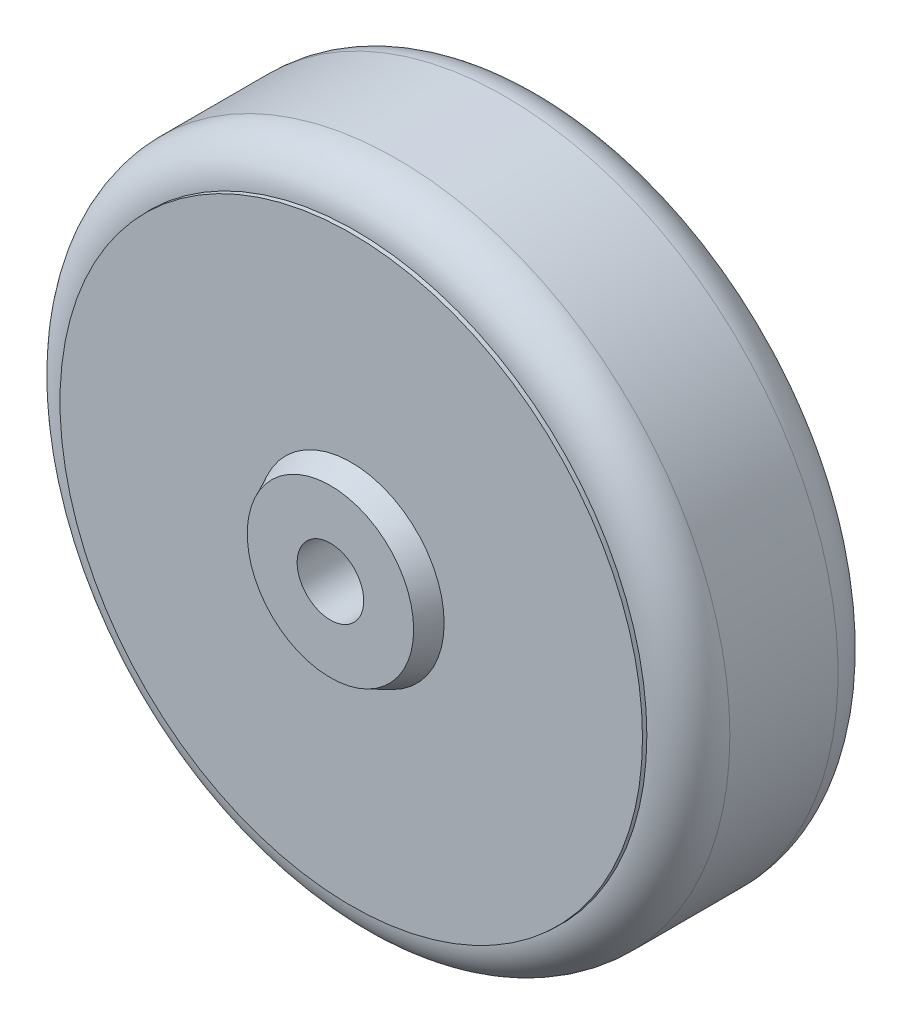
ISO-10303-21;
HEADER;
FILE_DESCRIPTION(('STEP AP214'),'2;1');
FILE_NAME('part.step','',(''),(''),'','','');
FILE_SCHEMA(('AUTOMOTIVE_DESIGN { 1 0 10303 214 1 1 1 1 }'));
ENDSEC;
DATA;
#1=APPLICATION_CONTEXT('core data for automotive mechanical design processes');
#2=APPLICATION_PROTOCOL_DEFINITION('international standard','automotive_design',2000,#1);
#3=PRODUCT_CONTEXT('',#1,'mechanical');
#4=PRODUCT('Part','Part','',(#3));
#5=PRODUCT_RELATED_PRODUCT_CATEGORY('part','',(#4));
#6=PRODUCT_DEFINITION_FORMATION('','',#4);
#7=PRODUCT_DEFINITION_CONTEXT('part definition',#1,'design');
#8=PRODUCT_DEFINITION('design','',#6,#7);
#9=PRODUCT_DEFINITION_SHAPE('','',#8);
#10=(LENGTH_UNIT() NAMED_UNIT(*) SI_UNIT(.MILLI.,.METRE.));
#11=(NAMED_UNIT(*) PLANE_ANGLE_UNIT() SI_UNIT($,.RADIAN.));
#12=(NAMED_UNIT(*) SI_UNIT($,.STERADIAN.) SOLID_ANGLE_UNIT());
#13=UNCERTAINTY_MEASURE_WITH_UNIT(LENGTH_MEASURE(1.E-05),#10,'distance_accuracy_value','');
#14=(GEOMETRIC_REPRESENTATION_CONTEXT(3) GLOBAL_UNCERTAINTY_ASSIGNED_CONTEXT((#13)) GLOBAL_UNIT_ASSIGNED_CONTEXT((#10,
#11,#12)) REPRESENTATION_CONTEXT('',''));
#15=CARTESIAN_POINT('',(0.,0.,0.));
#16=DIRECTION('',(0.,0.,1.));
#17=DIRECTION('',(1.,0.,0.));
#18=AXIS2_PLACEMENT_3D('',#15,#16,#17);
#19=CARTESIAN_POINT('',(0.,0.,62.));
#20=DIRECTION('',(0.,0.,-1.));
#21=DIRECTION('',(-1.,0.,0.));
#22=AXIS2_PLACEMENT_3D('',#19,#20,#21);
#23=CYLINDRICAL_SURFACE('',#22,80.);
#24=CARTESIAN_POINT('',(0.,0.,46.0001373297094));
#25=DIRECTION('',(0.,0.,1.));
#26=DIRECTION('',(1.,0.,0.));
#27=AXIS2_PLACEMENT_3D('',#24,#25,#26);
#28=CIRCLE('',#27,80.);
#29=CARTESIAN_POINT('',(80.,0.,46.0001373297094));
#30=VERTEX_POINT('',#29);
#31=EDGE_CURVE('E13',#30,#30,#28,.F.);
#32=ORIENTED_EDGE('',*,*,#31,.T.);
#33=EDGE_LOOP('',(#32));
#34=FACE_BOUND('',#33,.T.);
#35=CARTESIAN_POINT('',(0.,0.,20.));
#36=DIRECTION('',(0.,0.,-1.));
#37=DIRECTION('',(-1.,0.,0.));
#38=AXIS2_PLACEMENT_3D('',#35,#36,#37);
#39=CIRCLE('',#38,80.);
#40=CARTESIAN_POINT('',(-80.,0.,20.));
#41=VERTEX_POINT('',#40);
#42=EDGE_CURVE('E72',#41,#41,#39,.F.);
#43=ORIENTED_EDGE('',*,*,#42,.T.);
#44=EDGE_LOOP('',(#43));
#45=FACE_BOUND('',#44,.T.);
#46=ADVANCED_FACE('F63',(#34,#45),#23,.T.);
#47=CARTESIAN_POINT('',(0.,0.,10.));
#48=DIRECTION('',(0.,0.,-1.));
#49=DIRECTION('',(-1.,0.,0.));
#50=AXIS2_PLACEMENT_3D('',#47,#48,#49);
#51=PLANE('',#50);
#52=CARTESIAN_POINT('',(0.,0.,10.));
#53=DIRECTION('',(0.,0.,-1.));
#54=DIRECTION('',(-1.,0.,0.));
#55=AXIS2_PLACEMENT_3D('',#52,#53,#54);
#56=CIRCLE('',#55,68.142135623731);
#57=CARTESIAN_POINT('',(-68.142135623731,0.,10.));
#58=VERTEX_POINT('',#57);
#59=EDGE_CURVE('E390',#58,#58,#56,.F.);
#60=ORIENTED_EDGE('',*,*,#59,.T.);
#61=EDGE_LOOP('',(#60));
#62=FACE_BOUND('',#61,.T.);
#63=CARTESIAN_POINT('',(0.,0.,10.));
#64=DIRECTION('',(0.,0.,-1.));
#65=DIRECTION('',(-1.,0.,0.));
#66=AXIS2_PLACEMENT_3D('',#63,#64,#65);
#67=CIRCLE('',#66,70.);
#68=CARTESIAN_POINT('',(-70.,0.,10.));
#69=VERTEX_POINT('',#68);
#70=EDGE_CURVE('E386',#69,#69,#67,.T.);
#71=ORIENTED_EDGE('',*,*,#70,.T.);
#72=EDGE_LOOP('',(#71));
#73=FACE_BOUND('',#72,.T.);
#74=ADVANCED_FACE('F404',(#62,#73),#51,.T.);
#75=CARTESIAN_POINT('',(0.,0.,0.));
#76=DIRECTION('',(0.,0.,1.));
#77=DIRECTION('',(-1.,0.,0.));
#78=AXIS2_PLACEMENT_3D('',#75,#76,#77);
#79=CONICAL_SURFACE('',#78,54.,0.78539816339745);
#80=CARTESIAN_POINT('',(0.,0.,7.07106781186547));
#81=DIRECTION('',(0.,0.,1.));
#82=DIRECTION('',(1.,0.,0.));
#83=AXIS2_PLACEMENT_3D('',#80,#81,#82);
#84=CIRCLE('',#83,61.0710678118655);
#85=CARTESIAN_POINT('',(61.0710678118655,0.,7.07106781186547));
#86=VERTEX_POINT('',#85);
#87=EDGE_CURVE('E382',#86,#86,#84,.F.);
#88=ORIENTED_EDGE('',*,*,#87,.T.);
#89=EDGE_LOOP('',(#88));
#90=FACE_BOUND('',#89,.T.);
#91=CARTESIAN_POINT('',(0.,0.,0.));
#92=DIRECTION('',(0.,0.,-1.));
#93=DIRECTION('',(-1.,0.,0.));
#94=AXIS2_PLACEMENT_3D('',#91,#92,#93);
#95=CIRCLE('',#94,54.);
#96=CARTESIAN_POINT('',(-54.,0.,0.));
#97=VERTEX_POINT('',#96);
#98=EDGE_CURVE('E378',#97,#97,#95,.T.);
#99=ORIENTED_EDGE('',*,*,#98,.F.);
#100=EDGE_LOOP('',(#99));
#101=FACE_BOUND('',#100,.T.);
#102=ADVANCED_FACE('F406',(#90,#101),#79,.T.);
#103=CARTESIAN_POINT('',(0.,0.,0.));
#104=DIRECTION('',(0.,0.,1.));
#105=DIRECTION('',(1.,0.,0.));
#106=AXIS2_PLACEMENT_3D('',#103,#104,#105);
#107=PLANE('',#106);
#108=DIRECTION('',(-0.422618261740707,0.906307787036646,0.));
#109=VECTOR('',#108,1.);
#110=CARTESIAN_POINT('',(-6.33927392611046,13.5946168055498,0.));
#111=LINE('',#110,#109);
#112=CARTESIAN_POINT('',(-6.33927392611046,13.5946168055498,0.));
#113=VERTEX_POINT('',#112);
#114=CARTESIAN_POINT('',(-21.1309130870352,45.3153893518324,0.));
#115=VERTEX_POINT('',#114);
#116=EDGE_CURVE('E243',#113,#115,#111,.T.);
#117=ORIENTED_EDGE('',*,*,#116,.F.);
#118=CARTESIAN_POINT('',(0.,0.,0.));
#119=DIRECTION('',(0.,0.,-1.));
#120=DIRECTION('',(-1.,0.,0.));
#121=AXIS2_PLACEMENT_3D('',#118,#119,#120);
#122=CIRCLE('',#121,15.);
#123=CARTESIAN_POINT('',(-10.9703055242876,10.2299754009374,0.));
#124=VERTEX_POINT('',#123);
#125=EDGE_CURVE('E79',#124,#113,#122,.T.);
#126=ORIENTED_EDGE('',*,*,#125,.F.);
#127=DIRECTION('',(0.731353701619174,-0.681998360062495,0.));
#128=VECTOR('',#127,1.);
#129=CARTESIAN_POINT('',(-10.9703055242876,10.2299754009374,0.));
#130=LINE('',#129,#128);
#131=CARTESIAN_POINT('',(-36.5676850809587,34.0999180031247,0.));
#132=VERTEX_POINT('',#131);
#133=EDGE_CURVE('E313',#132,#124,#130,.T.);
#134=ORIENTED_EDGE('',*,*,#133,.F.);
#135=CARTESIAN_POINT('',(0.,0.,0.));
#136=DIRECTION('',(0.,0.,-1.));
#137=DIRECTION('',(-1.,0.,0.));
#138=AXIS2_PLACEMENT_3D('',#135,#136,#137);
#139=CIRCLE('',#138,50.);
#140=CARTESIAN_POINT('',(-49.6273075820661,-6.0934671702574,0.));
#141=VERTEX_POINT('',#140);
#142=EDGE_CURVE('E310',#141,#132,#139,.T.);
#143=ORIENTED_EDGE('',*,*,#142,.F.);
#144=DIRECTION('',(-0.992546151641322,-0.121869343405148,0.));
#145=VECTOR('',#144,1.);
#146=CARTESIAN_POINT('',(-14.8881922746198,-1.82804015107722,0.));
#147=LINE('',#146,#145);
#148=CARTESIAN_POINT('',(-14.8881922746198,-1.82804015107722,0.));
#149=VERTEX_POINT('',#148);
#150=EDGE_CURVE('E211',#149,#141,#147,.T.);
#151=ORIENTED_EDGE('',*,*,#150,.F.);
#152=CARTESIAN_POINT('',(0.,0.,0.));
#153=DIRECTION('',(0.,0.,-1.));
#154=DIRECTION('',(-1.,0.,0.));
#155=AXIS2_PLACEMENT_3D('',#152,#153,#154);
#156=CIRCLE('',#155,15.);
#157=CARTESIAN_POINT('',(-13.1192956070909,-7.27214430369509,0.));
#158=VERTEX_POINT('',#157);
#159=EDGE_CURVE('E304',#158,#149,#156,.T.);
#160=ORIENTED_EDGE('',*,*,#159,.F.);
#161=DIRECTION('',(0.874619707139395,0.484809620246339,0.));
#162=VECTOR('',#161,1.);
#163=CARTESIAN_POINT('',(-13.1192956070909,-7.27214430369509,0.));
#164=LINE('',#163,#162);
#165=CARTESIAN_POINT('',(-43.7309853569697,-24.240481012317,0.));
#166=VERTEX_POINT('',#165);
#167=EDGE_CURVE('E300',#166,#158,#164,.T.);
#168=ORIENTED_EDGE('',*,*,#167,.F.);
#169=CARTESIAN_POINT('',(0.,0.,0.));
#170=DIRECTION('',(0.,0.,-1.));
#171=DIRECTION('',(-1.,0.,0.));
#172=AXIS2_PLACEMENT_3D('',#169,#170,#171);
#173=CIRCLE('',#172,50.);
#174=CARTESIAN_POINT('',(-9.54044976882699,-49.0813591723833,0.));
#175=VERTEX_POINT('',#174);
#176=EDGE_CURVE('E296',#175,#166,#173,.T.);
#177=ORIENTED_EDGE('',*,*,#176,.F.);
#178=DIRECTION('',(-0.190808995376537,-0.981627183447666,0.));
#179=VECTOR('',#178,1.);
#180=CARTESIAN_POINT('',(-2.86213493064821,-14.724407751715,0.));
#181=LINE('',#180,#179);
#182=CARTESIAN_POINT('',(-2.8621349306482,-14.724407751715,0.));
#183=VERTEX_POINT('',#182);
#184=EDGE_CURVE('E292',#183,#175,#181,.T.);
#185=ORIENTED_EDGE('',*,*,#184,.F.);
#186=CARTESIAN_POINT('',(0.,0.,0.));
#187=DIRECTION('',(0.,0.,-1.));
#188=DIRECTION('',(-1.,0.,0.));
#189=AXIS2_PLACEMENT_3D('',#186,#187,#188);
#190=CIRCLE('',#189,15.);
#191=CARTESIAN_POINT('',(2.86213493064821,-14.724407751715,0.));
#192=VERTEX_POINT('',#191);
#193=EDGE_CURVE('E288',#192,#183,#190,.T.);
#194=ORIENTED_EDGE('',*,*,#193,.F.);
#195=DIRECTION('',(-0.190808995376547,0.981627183447664,0.));
#196=VECTOR('',#195,1.);
#197=CARTESIAN_POINT('',(2.86213493064821,-14.724407751715,0.));
#198=LINE('',#197,#196);
#199=CARTESIAN_POINT('',(9.54044976882736,-49.0813591723832,0.));
#200=VERTEX_POINT('',#199);
#201=EDGE_CURVE('E284',#200,#192,#198,.T.);
#202=ORIENTED_EDGE('',*,*,#201,.F.);
#203=CARTESIAN_POINT('',(0.,0.,0.));
#204=DIRECTION('',(0.,0.,-1.));
#205=DIRECTION('',(-1.,0.,0.));
#206=AXIS2_PLACEMENT_3D('',#203,#204,#205);
#207=CIRCLE('',#206,50.);
#208=CARTESIAN_POINT('',(43.7309853569699,-24.2404810123166,0.));
#209=VERTEX_POINT('',#208);
#210=EDGE_CURVE('E280',#209,#200,#207,.T.);
#211=ORIENTED_EDGE('',*,*,#210,.F.);
#212=DIRECTION('',(0.8746197071394,-0.48480962024633,0.));
#213=VECTOR('',#212,1.);
#214=CARTESIAN_POINT('',(13.1192956070909,-7.27214430369509,0.));
#215=LINE('',#214,#213);
#216=CARTESIAN_POINT('',(13.1192956070909,-7.27214430369509,0.));
#217=VERTEX_POINT('',#216);
#218=EDGE_CURVE('E276',#217,#209,#215,.T.);
#219=ORIENTED_EDGE('',*,*,#218,.F.);
#220=CARTESIAN_POINT('',(0.,0.,0.));
#221=DIRECTION('',(0.,0.,-1.));
#222=DIRECTION('',(-1.,0.,0.));
#223=AXIS2_PLACEMENT_3D('',#220,#221,#222);
#224=CIRCLE('',#223,15.);
#225=CARTESIAN_POINT('',(14.8881922746198,-1.82804015107717,0.));
#226=VERTEX_POINT('',#225);
#227=EDGE_CURVE('E272',#226,#217,#224,.T.);
#228=ORIENTED_EDGE('',*,*,#227,.F.);
#229=DIRECTION('',(-0.992546151641321,0.121869343405158,0.));
#230=VECTOR('',#229,1.);
#231=CARTESIAN_POINT('',(14.8881922746198,-1.82804015107717,0.));
#232=LINE('',#231,#230);
#233=CARTESIAN_POINT('',(49.6273075820658,-6.09346717025766,0.));
#234=VERTEX_POINT('',#233);
#235=EDGE_CURVE('E268',#234,#226,#232,.T.);
#236=ORIENTED_EDGE('',*,*,#235,.F.);
#237=CARTESIAN_POINT('',(0.,0.,0.));
#238=DIRECTION('',(0.,0.,-1.));
#239=DIRECTION('',(-1.,0.,0.));
#240=AXIS2_PLACEMENT_3D('',#237,#238,#239);
#241=CIRCLE('',#240,49.9999999999997);
#242=CARTESIAN_POINT('',(36.5676850809582,34.0999180031252,0.));
#243=VERTEX_POINT('',#242);
#244=EDGE_CURVE('E264',#243,#234,#241,.T.);
#245=ORIENTED_EDGE('',*,*,#244,.F.);
#246=DIRECTION('',(0.731353701619164,0.681998360062505,0.));
#247=VECTOR('',#246,1.);
#248=CARTESIAN_POINT('',(10.9703055242875,10.2299754009376,0.));
#249=LINE('',#248,#247);
#250=CARTESIAN_POINT('',(10.9703055242875,10.2299754009376,0.));
#251=VERTEX_POINT('',#250);
#252=EDGE_CURVE('E260',#251,#243,#249,.T.);
#253=ORIENTED_EDGE('',*,*,#252,.F.);
#254=CARTESIAN_POINT('',(0.,0.,0.));
#255=DIRECTION('',(0.,0.,-1.));
#256=DIRECTION('',(-1.,0.,0.));
#257=AXIS2_PLACEMENT_3D('',#254,#255,#256);
#258=CIRCLE('',#257,15.);
#259=CARTESIAN_POINT('',(6.33927392611046,13.5946168055498,0.));
#260=VERTEX_POINT('',#259);
#261=EDGE_CURVE('E256',#260,#251,#258,.T.);
#262=ORIENTED_EDGE('',*,*,#261,.F.);
#263=DIRECTION('',(-0.422618261740708,-0.906307787036646,0.));
#264=VECTOR('',#263,1.);
#265=CARTESIAN_POINT('',(6.33927392611046,13.5946168055498,0.));
#266=LINE('',#265,#264);
#267=CARTESIAN_POINT('',(21.1309130870353,45.3153893518324,0.));
#268=VERTEX_POINT('',#267);
#269=EDGE_CURVE('E252',#268,#260,#266,.T.);
#270=ORIENTED_EDGE('',*,*,#269,.F.);
#271=CARTESIAN_POINT('',(0.,0.,0.));
#272=DIRECTION('',(0.,0.,-1.));
#273=DIRECTION('',(-1.,0.,0.));
#274=AXIS2_PLACEMENT_3D('',#271,#272,#273);
#275=CIRCLE('',#274,50.);
#276=EDGE_CURVE('E248',#115,#268,#275,.T.);
#277=ORIENTED_EDGE('',*,*,#276,.F.);
#278=EDGE_LOOP('',(#117,#126,#134,#143,#151,#160,#168,#177,#185,#194,#202,#211,#219,#228,#236,
#245,#253,#262,#270,#277));
#279=FACE_BOUND('',#278,.T.);
#280=ORIENTED_EDGE('',*,*,#98,.T.);
#281=EDGE_LOOP('',(#280));
#282=FACE_BOUND('',#281,.T.);
#283=ADVANCED_FACE('F413',(#279,#282),#107,.F.);
#284=CARTESIAN_POINT('',(0.,0.,2.));
#285=DIRECTION('',(0.,0.,-1.));
#286=DIRECTION('',(-1.,0.,0.));
#287=AXIS2_PLACEMENT_3D('',#284,#285,#286);
#288=CYLINDRICAL_SURFACE('',#287,15.);
#289=ORIENTED_EDGE('',*,*,#125,.T.);
#290=DIRECTION('',(0.,0.,-1.));
#291=VECTOR('',#290,1.);
#292=CARTESIAN_POINT('',(-6.33927392611046,13.5946168055498,2.));
#293=LINE('',#292,#291);
#294=CARTESIAN_POINT('',(-6.33927392611046,13.5946168055498,2.));
#295=VERTEX_POINT('',#294);
#296=EDGE_CURVE('E151',#295,#113,#293,.T.);
#297=ORIENTED_EDGE('',*,*,#296,.F.);
#298=CARTESIAN_POINT('',(0.,0.,2.));
#299=DIRECTION('',(0.,0.,-1.));
#300=DIRECTION('',(-1.,0.,0.));
#301=AXIS2_PLACEMENT_3D('',#298,#299,#300);
#302=CIRCLE('',#301,15.);
#303=CARTESIAN_POINT('',(-10.9703055242876,10.2299754009374,2.));
#304=VERTEX_POINT('',#303);
#305=EDGE_CURVE('E316',#304,#295,#302,.T.);
#306=ORIENTED_EDGE('',*,*,#305,.F.);
#307=DIRECTION('',(0.,0.,-1.));
#308=VECTOR('',#307,1.);
#309=CARTESIAN_POINT('',(-10.9703055242876,10.2299754009374,2.));
#310=LINE('',#309,#308);
#311=EDGE_CURVE('E87',#304,#124,#310,.T.);
#312=ORIENTED_EDGE('',*,*,#311,.T.);
#313=EDGE_LOOP('',(#289,#297,#306,#312));
#314=FACE_BOUND('',#313,.T.);
#315=ADVANCED_FACE('F428',(#314),#288,.F.);
#316=CARTESIAN_POINT('',(-10.9703055242876,10.2299754009374,2.));
#317=DIRECTION('',(0.681998360062495,0.731353701619174,0.));
#318=DIRECTION('',(-0.731353701619174,0.681998360062495,0.));
#319=AXIS2_PLACEMENT_3D('',#316,#317,#318);
#320=PLANE('',#319);
#321=ORIENTED_EDGE('',*,*,#133,.T.);
#322=ORIENTED_EDGE('',*,*,#311,.F.);
#323=DIRECTION('',(0.731353701619174,-0.681998360062495,0.));
#324=VECTOR('',#323,1.);
#325=CARTESIAN_POINT('',(-10.9703055242876,10.2299754009374,2.));
#326=LINE('',#325,#324);
#327=CARTESIAN_POINT('',(-36.5676850809587,34.0999180031247,2.));
#328=VERTEX_POINT('',#327);
#329=EDGE_CURVE('E225',#328,#304,#326,.T.);
#330=ORIENTED_EDGE('',*,*,#329,.F.);
#331=DIRECTION('',(0.,0.,-1.));
#332=VECTOR('',#331,1.);
#333=CARTESIAN_POINT('',(-36.5676850809587,34.0999180031247,2.));
#334=LINE('',#333,#332);
#335=EDGE_CURVE('E216',#328,#132,#334,.T.);
#336=ORIENTED_EDGE('',*,*,#335,.T.);
#337=EDGE_LOOP('',(#321,#322,#330,#336));
#338=FACE_BOUND('',#337,.T.);
#339=ADVANCED_FACE('F522',(#338),#320,.F.);
#340=CARTESIAN_POINT('',(0.,0.,2.));
#341=DIRECTION('',(0.,0.,-1.));
#342=DIRECTION('',(-1.,0.,0.));
#343=AXIS2_PLACEMENT_3D('',#340,#341,#342);
#344=CYLINDRICAL_SURFACE('',#343,50.);
#345=ORIENTED_EDGE('',*,*,#142,.T.);
#346=ORIENTED_EDGE('',*,*,#335,.F.);
#347=CARTESIAN_POINT('',(0.,0.,2.));
#348=DIRECTION('',(0.,0.,-1.));
#349=DIRECTION('',(-1.,0.,0.));
#350=AXIS2_PLACEMENT_3D('',#347,#348,#349);
#351=CIRCLE('',#350,50.);
#352=CARTESIAN_POINT('',(-49.6273075820661,-6.0934671702574,2.));
#353=VERTEX_POINT('',#352);
#354=EDGE_CURVE('E220',#353,#328,#351,.T.);
#355=ORIENTED_EDGE('',*,*,#354,.F.);
#356=DIRECTION('',(0.,0.,-1.));
#357=VECTOR('',#356,1.);
#358=CARTESIAN_POINT('',(-49.6273075820661,-6.0934671702574,2.));
#359=LINE('',#358,#357);
#360=EDGE_CURVE('E204',#353,#141,#359,.T.);
#361=ORIENTED_EDGE('',*,*,#360,.T.);
#362=EDGE_LOOP('',(#345,#346,#355,#361));
#363=FACE_BOUND('',#362,.T.);
#364=ADVANCED_FACE('F221',(#363),#344,.F.);
#365=CARTESIAN_POINT('',(-14.8881922746198,-1.82804015107722,2.));
#366=DIRECTION('',(0.121869343405148,-0.992546151641322,0.));
#367=DIRECTION('',(0.992546151641322,0.121869343405148,0.));
#368=AXIS2_PLACEMENT_3D('',#365,#366,#367);
#369=PLANE('',#368);
#370=ORIENTED_EDGE('',*,*,#150,.T.);
#371=ORIENTED_EDGE('',*,*,#360,.F.);
#372=DIRECTION('',(-0.992546151641322,-0.121869343405148,0.));
#373=VECTOR('',#372,1.);
#374=CARTESIAN_POINT('',(-14.8881922746198,-1.82804015107722,2.));
#375=LINE('',#374,#373);
#376=CARTESIAN_POINT('',(-14.8881922746198,-1.82804015107722,2.));
#377=VERTEX_POINT('',#376);
#378=EDGE_CURVE('E208',#377,#353,#375,.T.);
#379=ORIENTED_EDGE('',*,*,#378,.F.);
#380=DIRECTION('',(0.,0.,-1.));
#381=VECTOR('',#380,1.);
#382=CARTESIAN_POINT('',(-14.8881922746198,-1.82804015107722,2.));
#383=LINE('',#382,#381);
#384=EDGE_CURVE('E217',#377,#149,#383,.T.);
#385=ORIENTED_EDGE('',*,*,#384,.T.);
#386=EDGE_LOOP('',(#370,#371,#379,#385));
#387=FACE_BOUND('',#386,.T.);
#388=ADVANCED_FACE('F206',(#387),#369,.F.);
#389=CARTESIAN_POINT('',(0.,0.,2.));
#390=DIRECTION('',(0.,0.,-1.));
#391=DIRECTION('',(-1.,0.,0.));
#392=AXIS2_PLACEMENT_3D('',#389,#390,#391);
#393=CYLINDRICAL_SURFACE('',#392,15.);
#394=ORIENTED_EDGE('',*,*,#159,.T.);
#395=ORIENTED_EDGE('',*,*,#384,.F.);
#396=CARTESIAN_POINT('',(0.,0.,2.));
#397=DIRECTION('',(0.,0.,-1.));
#398=DIRECTION('',(-1.,0.,0.));
#399=AXIS2_PLACEMENT_3D('',#396,#397,#398);
#400=CIRCLE('',#399,15.);
#401=CARTESIAN_POINT('',(-13.1192956070909,-7.27214430369509,2.));
#402=VERTEX_POINT('',#401);
#403=EDGE_CURVE('E231',#402,#377,#400,.T.);
#404=ORIENTED_EDGE('',*,*,#403,.F.);
#405=DIRECTION('',(0.,0.,-1.));
#406=VECTOR('',#405,1.);
#407=CARTESIAN_POINT('',(-13.1192956070909,-7.27214430369509,2.));
#408=LINE('',#407,#406);
#409=EDGE_CURVE('E324',#402,#158,#408,.T.);
#410=ORIENTED_EDGE('',*,*,#409,.T.);
#411=EDGE_LOOP('',(#394,#395,#404,#410));
#412=FACE_BOUND('',#411,.T.);
#413=ADVANCED_FACE('F518',(#412),#393,.F.);
#414=CARTESIAN_POINT('',(-13.1192956070909,-7.27214430369509,2.));
#415=DIRECTION('',(-0.484809620246339,0.874619707139395,0.));
#416=DIRECTION('',(-0.874619707139395,-0.484809620246339,0.));
#417=AXIS2_PLACEMENT_3D('',#414,#415,#416);
#418=PLANE('',#417);
#419=ORIENTED_EDGE('',*,*,#167,.T.);
#420=ORIENTED_EDGE('',*,*,#409,.F.);
#421=DIRECTION('',(0.874619707139395,0.484809620246339,0.));
#422=VECTOR('',#421,1.);
#423=CARTESIAN_POINT('',(-13.1192956070909,-7.27214430369509,2.));
#424=LINE('',#423,#422);
#425=CARTESIAN_POINT('',(-43.7309853569697,-24.240481012317,2.));
#426=VERTEX_POINT('',#425);
#427=EDGE_CURVE('E235',#426,#402,#424,.T.);
#428=ORIENTED_EDGE('',*,*,#427,.F.);
#429=DIRECTION('',(0.,0.,-1.));
#430=VECTOR('',#429,1.);
#431=CARTESIAN_POINT('',(-43.7309853569697,-24.240481012317,2.));
#432=LINE('',#431,#430);
#433=EDGE_CURVE('E327',#426,#166,#432,.T.);
#434=ORIENTED_EDGE('',*,*,#433,.T.);
#435=EDGE_LOOP('',(#419,#420,#428,#434));
#436=FACE_BOUND('',#435,.T.);
#437=ADVANCED_FACE('F514',(#436),#418,.F.);
#438=CARTESIAN_POINT('',(0.,0.,2.));
#439=DIRECTION('',(0.,0.,-1.));
#440=DIRECTION('',(-1.,0.,0.));
#441=AXIS2_PLACEMENT_3D('',#438,#439,#440);
#442=CYLINDRICAL_SURFACE('',#441,50.);
#443=ORIENTED_EDGE('',*,*,#176,.T.);
#444=ORIENTED_EDGE('',*,*,#433,.F.);
#445=CARTESIAN_POINT('',(0.,0.,2.));
#446=DIRECTION('',(0.,0.,-1.));
#447=DIRECTION('',(-1.,0.,0.));
#448=AXIS2_PLACEMENT_3D('',#445,#446,#447);
#449=CIRCLE('',#448,50.);
#450=CARTESIAN_POINT('',(-9.54044976882699,-49.0813591723833,2.));
#451=VERTEX_POINT('',#450);
#452=EDGE_CURVE('E507',#451,#426,#449,.T.);
#453=ORIENTED_EDGE('',*,*,#452,.F.);
#454=DIRECTION('',(0.,0.,-1.));
#455=VECTOR('',#454,1.);
#456=CARTESIAN_POINT('',(-9.54044976882699,-49.0813591723833,2.));
#457=LINE('',#456,#455);
#458=EDGE_CURVE('E330',#451,#175,#457,.T.);
#459=ORIENTED_EDGE('',*,*,#458,.T.);
#460=EDGE_LOOP('',(#443,#444,#453,#459));
#461=FACE_BOUND('',#460,.T.);
#462=ADVANCED_FACE('F559',(#461),#442,.F.);
#463=CARTESIAN_POINT('',(-2.86213493064821,-14.724407751715,2.));
#464=DIRECTION('',(0.981627183447666,-0.190808995376537,0.));
#465=DIRECTION('',(0.190808995376537,0.981627183447666,0.));
#466=AXIS2_PLACEMENT_3D('',#463,#464,#465);
#467=PLANE('',#466);
#468=ORIENTED_EDGE('',*,*,#184,.T.);
#469=ORIENTED_EDGE('',*,*,#458,.F.);
#470=DIRECTION('',(-0.190808995376537,-0.981627183447666,0.));
#471=VECTOR('',#470,1.);
#472=CARTESIAN_POINT('',(-2.86213493064821,-14.724407751715,2.));
#473=LINE('',#472,#471);
#474=CARTESIAN_POINT('',(-2.8621349306482,-14.724407751715,2.));
#475=VERTEX_POINT('',#474);
#476=EDGE_CURVE('E503',#475,#451,#473,.T.);
#477=ORIENTED_EDGE('',*,*,#476,.F.);
#478=DIRECTION('',(0.,0.,-1.));
#479=VECTOR('',#478,1.);
#480=CARTESIAN_POINT('',(-2.8621349306482,-14.724407751715,2.));
#481=LINE('',#480,#479);
#482=EDGE_CURVE('E333',#475,#183,#481,.T.);
#483=ORIENTED_EDGE('',*,*,#482,.T.);
#484=EDGE_LOOP('',(#468,#469,#477,#483));
#485=FACE_BOUND('',#484,.T.);
#486=ADVANCED_FACE('F562',(#485),#467,.F.);
#487=CARTESIAN_POINT('',(0.,0.,2.));
#488=DIRECTION('',(0.,0.,-1.));
#489=DIRECTION('',(-1.,0.,0.));
#490=AXIS2_PLACEMENT_3D('',#487,#488,#489);
#491=CYLINDRICAL_SURFACE('',#490,15.);
#492=ORIENTED_EDGE('',*,*,#193,.T.);
#493=ORIENTED_EDGE('',*,*,#482,.F.);
#494=CARTESIAN_POINT('',(0.,0.,2.));
#495=DIRECTION('',(0.,0.,-1.));
#496=DIRECTION('',(-1.,0.,0.));
#497=AXIS2_PLACEMENT_3D('',#494,#495,#496);
#498=CIRCLE('',#497,15.);
#499=CARTESIAN_POINT('',(2.86213493064821,-14.724407751715,2.));
#500=VERTEX_POINT('',#499);
#501=EDGE_CURVE('E499',#500,#475,#498,.T.);
#502=ORIENTED_EDGE('',*,*,#501,.F.);
#503=DIRECTION('',(0.,0.,-1.));
#504=VECTOR('',#503,1.);
#505=CARTESIAN_POINT('',(2.86213493064821,-14.724407751715,2.));
#506=LINE('',#505,#504);
#507=EDGE_CURVE('E336',#500,#192,#506,.T.);
#508=ORIENTED_EDGE('',*,*,#507,.T.);
#509=EDGE_LOOP('',(#492,#493,#502,#508));
#510=FACE_BOUND('',#509,.T.);
#511=ADVANCED_FACE('F566',(#510),#491,.F.);
#512=CARTESIAN_POINT('',(2.86213493064821,-14.724407751715,2.));
#513=DIRECTION('',(-0.981627183447664,-0.190808995376547,0.));
#514=DIRECTION('',(0.190808995376547,-0.981627183447664,0.));
#515=AXIS2_PLACEMENT_3D('',#512,#513,#514);
#516=PLANE('',#515);
#517=ORIENTED_EDGE('',*,*,#201,.T.);
#518=ORIENTED_EDGE('',*,*,#507,.F.);
#519=DIRECTION('',(-0.190808995376547,0.981627183447664,0.));
#520=VECTOR('',#519,1.);
#521=CARTESIAN_POINT('',(2.86213493064821,-14.724407751715,2.));
#522=LINE('',#521,#520);
#523=CARTESIAN_POINT('',(9.54044976882736,-49.0813591723832,2.));
#524=VERTEX_POINT('',#523);
#525=EDGE_CURVE('E495',#524,#500,#522,.T.);
#526=ORIENTED_EDGE('',*,*,#525,.F.);
#527=DIRECTION('',(0.,0.,-1.));
#528=VECTOR('',#527,1.);
#529=CARTESIAN_POINT('',(9.54044976882736,-49.0813591723832,2.));
#530=LINE('',#529,#528);
#531=EDGE_CURVE('E339',#524,#200,#530,.T.);
#532=ORIENTED_EDGE('',*,*,#531,.T.);
#533=EDGE_LOOP('',(#517,#518,#526,#532));
#534=FACE_BOUND('',#533,.T.);
#535=ADVANCED_FACE('F570',(#534),#516,.F.);
#536=CARTESIAN_POINT('',(0.,0.,2.));
#537=DIRECTION('',(0.,0.,-1.));
#538=DIRECTION('',(-1.,0.,0.));
#539=AXIS2_PLACEMENT_3D('',#536,#537,#538);
#540=CYLINDRICAL_SURFACE('',#539,50.);
#541=ORIENTED_EDGE('',*,*,#210,.T.);
#542=ORIENTED_EDGE('',*,*,#531,.F.);
#543=CARTESIAN_POINT('',(0.,0.,2.));
#544=DIRECTION('',(0.,0.,-1.));
#545=DIRECTION('',(-1.,0.,0.));
#546=AXIS2_PLACEMENT_3D('',#543,#544,#545);
#547=CIRCLE('',#546,50.);
#548=CARTESIAN_POINT('',(43.7309853569699,-24.2404810123166,2.));
#549=VERTEX_POINT('',#548);
#550=EDGE_CURVE('E491',#549,#524,#547,.T.);
#551=ORIENTED_EDGE('',*,*,#550,.F.);
#552=DIRECTION('',(0.,0.,-1.));
#553=VECTOR('',#552,1.);
#554=CARTESIAN_POINT('',(43.7309853569699,-24.2404810123166,2.));
#555=LINE('',#554,#553);
#556=EDGE_CURVE('E342',#549,#209,#555,.T.);
#557=ORIENTED_EDGE('',*,*,#556,.T.);
#558=EDGE_LOOP('',(#541,#542,#551,#557));
#559=FACE_BOUND('',#558,.T.);
#560=ADVANCED_FACE('F574',(#559),#540,.F.);
#561=CARTESIAN_POINT('',(13.1192956070909,-7.27214430369509,2.));
#562=DIRECTION('',(0.48480962024633,0.8746197071394,0.));
#563=DIRECTION('',(-0.8746197071394,0.48480962024633,0.));
#564=AXIS2_PLACEMENT_3D('',#561,#562,#563);
#565=PLANE('',#564);
#566=ORIENTED_EDGE('',*,*,#218,.T.);
#567=ORIENTED_EDGE('',*,*,#556,.F.);
#568=DIRECTION('',(0.8746197071394,-0.48480962024633,0.));
#569=VECTOR('',#568,1.);
#570=CARTESIAN_POINT('',(13.1192956070909,-7.27214430369509,2.));
#571=LINE('',#570,#569);
#572=CARTESIAN_POINT('',(13.1192956070909,-7.27214430369509,2.));
#573=VERTEX_POINT('',#572);
#574=EDGE_CURVE('E487',#573,#549,#571,.T.);
#575=ORIENTED_EDGE('',*,*,#574,.F.);
#576=DIRECTION('',(0.,0.,-1.));
#577=VECTOR('',#576,1.);
#578=CARTESIAN_POINT('',(13.1192956070909,-7.27214430369509,2.));
#579=LINE('',#578,#577);
#580=EDGE_CURVE('E345',#573,#217,#579,.T.);
#581=ORIENTED_EDGE('',*,*,#580,.T.);
#582=EDGE_LOOP('',(#566,#567,#575,#581));
#583=FACE_BOUND('',#582,.T.);
#584=ADVANCED_FACE('F578',(#583),#565,.F.);
#585=CARTESIAN_POINT('',(0.,0.,2.));
#586=DIRECTION('',(0.,0.,-1.));
#587=DIRECTION('',(-1.,0.,0.));
#588=AXIS2_PLACEMENT_3D('',#585,#586,#587);
#589=CYLINDRICAL_SURFACE('',#588,15.);
#590=ORIENTED_EDGE('',*,*,#227,.T.);
#591=ORIENTED_EDGE('',*,*,#580,.F.);
#592=CARTESIAN_POINT('',(0.,0.,2.));
#593=DIRECTION('',(0.,0.,-1.));
#594=DIRECTION('',(-1.,0.,0.));
#595=AXIS2_PLACEMENT_3D('',#592,#593,#594);
#596=CIRCLE('',#595,15.);
#597=CARTESIAN_POINT('',(14.8881922746198,-1.82804015107717,2.));
#598=VERTEX_POINT('',#597);
#599=EDGE_CURVE('E483',#598,#573,#596,.T.);
#600=ORIENTED_EDGE('',*,*,#599,.F.);
#601=DIRECTION('',(0.,0.,-1.));
#602=VECTOR('',#601,1.);
#603=CARTESIAN_POINT('',(14.8881922746198,-1.82804015107717,2.));
#604=LINE('',#603,#602);
#605=EDGE_CURVE('E348',#598,#226,#604,.T.);
#606=ORIENTED_EDGE('',*,*,#605,.T.);
#607=EDGE_LOOP('',(#590,#591,#600,#606));
#608=FACE_BOUND('',#607,.T.);
#609=ADVANCED_FACE('F582',(#608),#589,.F.);
#610=CARTESIAN_POINT('',(14.8881922746198,-1.82804015107717,2.));
#611=DIRECTION('',(-0.121869343405158,-0.992546151641321,0.));
#612=DIRECTION('',(0.992546151641321,-0.121869343405158,0.));
#613=AXIS2_PLACEMENT_3D('',#610,#611,#612);
#614=PLANE('',#613);
#615=ORIENTED_EDGE('',*,*,#235,.T.);
#616=ORIENTED_EDGE('',*,*,#605,.F.);
#617=DIRECTION('',(-0.992546151641321,0.121869343405158,0.));
#618=VECTOR('',#617,1.);
#619=CARTESIAN_POINT('',(14.8881922746198,-1.82804015107717,2.));
#620=LINE('',#619,#618);
#621=CARTESIAN_POINT('',(49.6273075820658,-6.09346717025766,2.));
#622=VERTEX_POINT('',#621);
#623=EDGE_CURVE('E479',#622,#598,#620,.T.);
#624=ORIENTED_EDGE('',*,*,#623,.F.);
#625=DIRECTION('',(0.,0.,-1.));
#626=VECTOR('',#625,1.);
#627=CARTESIAN_POINT('',(49.6273075820658,-6.09346717025766,2.));
#628=LINE('',#627,#626);
#629=EDGE_CURVE('E351',#622,#234,#628,.T.);
#630=ORIENTED_EDGE('',*,*,#629,.T.);
#631=EDGE_LOOP('',(#615,#616,#624,#630));
#632=FACE_BOUND('',#631,.T.);
#633=ADVANCED_FACE('F586',(#632),#614,.F.);
#634=CARTESIAN_POINT('',(0.,0.,2.));
#635=DIRECTION('',(0.,0.,-1.));
#636=DIRECTION('',(-1.,0.,0.));
#637=AXIS2_PLACEMENT_3D('',#634,#635,#636);
#638=CYLINDRICAL_SURFACE('',#637,49.9999999999997);
#639=ORIENTED_EDGE('',*,*,#244,.T.);
#640=ORIENTED_EDGE('',*,*,#629,.F.);
#641=CARTESIAN_POINT('',(0.,0.,2.));
#642=DIRECTION('',(0.,0.,-1.));
#643=DIRECTION('',(-1.,0.,0.));
#644=AXIS2_PLACEMENT_3D('',#641,#642,#643);
#645=CIRCLE('',#644,49.9999999999997);
#646=CARTESIAN_POINT('',(36.5676850809582,34.0999180031252,2.));
#647=VERTEX_POINT('',#646);
#648=EDGE_CURVE('E475',#647,#622,#645,.T.);
#649=ORIENTED_EDGE('',*,*,#648,.F.);
#650=DIRECTION('',(0.,0.,-1.));
#651=VECTOR('',#650,1.);
#652=CARTESIAN_POINT('',(36.5676850809582,34.0999180031252,2.));
#653=LINE('',#652,#651);
#654=EDGE_CURVE('E354',#647,#243,#653,.T.);
#655=ORIENTED_EDGE('',*,*,#654,.T.);
#656=EDGE_LOOP('',(#639,#640,#649,#655));
#657=FACE_BOUND('',#656,.T.);
#658=ADVANCED_FACE('F590',(#657),#638,.F.);
#659=CARTESIAN_POINT('',(10.9703055242875,10.2299754009376,2.));
#660=DIRECTION('',(-0.681998360062505,0.731353701619164,0.));
#661=DIRECTION('',(-0.731353701619164,-0.681998360062505,0.));
#662=AXIS2_PLACEMENT_3D('',#659,#660,#661);
#663=PLANE('',#662);
#664=ORIENTED_EDGE('',*,*,#252,.T.);
#665=ORIENTED_EDGE('',*,*,#654,.F.);
#666=DIRECTION('',(0.731353701619164,0.681998360062505,0.));
#667=VECTOR('',#666,1.);
#668=CARTESIAN_POINT('',(10.9703055242875,10.2299754009376,2.));
#669=LINE('',#668,#667);
#670=CARTESIAN_POINT('',(10.9703055242875,10.2299754009376,2.));
#671=VERTEX_POINT('',#670);
#672=EDGE_CURVE('E471',#671,#647,#669,.T.);
#673=ORIENTED_EDGE('',*,*,#672,.F.);
#674=DIRECTION('',(0.,0.,-1.));
#675=VECTOR('',#674,1.);
#676=CARTESIAN_POINT('',(10.9703055242875,10.2299754009376,2.));
#677=LINE('',#676,#675);
#678=EDGE_CURVE('E357',#671,#251,#677,.T.);
#679=ORIENTED_EDGE('',*,*,#678,.T.);
#680=EDGE_LOOP('',(#664,#665,#673,#679));
#681=FACE_BOUND('',#680,.T.);
#682=ADVANCED_FACE('F594',(#681),#663,.F.);
#683=CARTESIAN_POINT('',(0.,0.,2.));
#684=DIRECTION('',(0.,0.,-1.));
#685=DIRECTION('',(-1.,0.,0.));
#686=AXIS2_PLACEMENT_3D('',#683,#684,#685);
#687=CYLINDRICAL_SURFACE('',#686,15.);
#688=ORIENTED_EDGE('',*,*,#261,.T.);
#689=ORIENTED_EDGE('',*,*,#678,.F.);
#690=CARTESIAN_POINT('',(0.,0.,2.));
#691=DIRECTION('',(0.,0.,-1.));
#692=DIRECTION('',(-1.,0.,0.));
#693=AXIS2_PLACEMENT_3D('',#690,#691,#692);
#694=CIRCLE('',#693,15.);
#695=CARTESIAN_POINT('',(6.33927392611046,13.5946168055498,2.));
#696=VERTEX_POINT('',#695);
#697=EDGE_CURVE('E467',#696,#671,#694,.T.);
#698=ORIENTED_EDGE('',*,*,#697,.F.);
#699=DIRECTION('',(0.,0.,-1.));
#700=VECTOR('',#699,1.);
#701=CARTESIAN_POINT('',(6.33927392611046,13.5946168055498,2.));
#702=LINE('',#701,#700);
#703=EDGE_CURVE('E360',#696,#260,#702,.T.);
#704=ORIENTED_EDGE('',*,*,#703,.T.);
#705=EDGE_LOOP('',(#688,#689,#698,#704));
#706=FACE_BOUND('',#705,.T.);
#707=ADVANCED_FACE('F598',(#706),#687,.F.);
#708=CARTESIAN_POINT('',(6.33927392611046,13.5946168055498,2.));
#709=DIRECTION('',(0.906307787036646,-0.422618261740708,0.));
#710=DIRECTION('',(0.422618261740708,0.906307787036646,0.));
#711=AXIS2_PLACEMENT_3D('',#708,#709,#710);
#712=PLANE('',#711);
#713=ORIENTED_EDGE('',*,*,#269,.T.);
#714=ORIENTED_EDGE('',*,*,#703,.F.);
#715=DIRECTION('',(-0.422618261740708,-0.906307787036646,0.));
#716=VECTOR('',#715,1.);
#717=CARTESIAN_POINT('',(6.33927392611046,13.5946168055498,2.));
#718=LINE('',#717,#716);
#719=CARTESIAN_POINT('',(21.1309130870353,45.3153893518324,2.));
#720=VERTEX_POINT('',#719);
#721=EDGE_CURVE('E463',#720,#696,#718,.T.);
#722=ORIENTED_EDGE('',*,*,#721,.F.);
#723=DIRECTION('',(0.,0.,-1.));
#724=VECTOR('',#723,1.);
#725=CARTESIAN_POINT('',(21.1309130870353,45.3153893518324,2.));
#726=LINE('',#725,#724);
#727=EDGE_CURVE('E363',#720,#268,#726,.T.);
#728=ORIENTED_EDGE('',*,*,#727,.T.);
#729=EDGE_LOOP('',(#713,#714,#722,#728));
#730=FACE_BOUND('',#729,.T.);
#731=ADVANCED_FACE('F602',(#730),#712,.F.);
#732=CARTESIAN_POINT('',(0.,0.,2.));
#733=DIRECTION('',(0.,0.,-1.));
#734=DIRECTION('',(-1.,0.,0.));
#735=AXIS2_PLACEMENT_3D('',#732,#733,#734);
#736=CYLINDRICAL_SURFACE('',#735,50.);
#737=ORIENTED_EDGE('',*,*,#276,.T.);
#738=ORIENTED_EDGE('',*,*,#727,.F.);
#739=CARTESIAN_POINT('',(0.,0.,2.));
#740=DIRECTION('',(0.,0.,-1.));
#741=DIRECTION('',(-1.,0.,0.));
#742=AXIS2_PLACEMENT_3D('',#739,#740,#741);
#743=CIRCLE('',#742,50.);
#744=CARTESIAN_POINT('',(-21.1309130870352,45.3153893518324,2.));
#745=VERTEX_POINT('',#744);
#746=EDGE_CURVE('E459',#745,#720,#743,.T.);
#747=ORIENTED_EDGE('',*,*,#746,.F.);
#748=DIRECTION('',(0.,0.,-1.));
#749=VECTOR('',#748,1.);
#750=CARTESIAN_POINT('',(-21.1309130870352,45.3153893518324,2.));
#751=LINE('',#750,#749);
#752=EDGE_CURVE('E366',#745,#115,#751,.T.);
#753=ORIENTED_EDGE('',*,*,#752,.T.);
#754=EDGE_LOOP('',(#737,#738,#747,#753));
#755=FACE_BOUND('',#754,.T.);
#756=ADVANCED_FACE('F605',(#755),#736,.F.);
#757=CARTESIAN_POINT('',(-6.33927392611046,13.5946168055498,2.));
#758=DIRECTION('',(-0.906307787036646,-0.422618261740707,0.));
#759=DIRECTION('',(0.422618261740707,-0.906307787036646,0.));
#760=AXIS2_PLACEMENT_3D('',#757,#758,#759);
#761=PLANE('',#760);
#762=ORIENTED_EDGE('',*,*,#116,.T.);
#763=ORIENTED_EDGE('',*,*,#752,.F.);
#764=DIRECTION('',(-0.422618261740707,0.906307787036646,0.));
#765=VECTOR('',#764,1.);
#766=CARTESIAN_POINT('',(-6.33927392611046,13.5946168055498,2.));
#767=LINE('',#766,#765);
#768=EDGE_CURVE('E455',#295,#745,#767,.T.);
#769=ORIENTED_EDGE('',*,*,#768,.F.);
#770=ORIENTED_EDGE('',*,*,#296,.T.);
#771=EDGE_LOOP('',(#762,#763,#769,#770));
#772=FACE_BOUND('',#771,.T.);
#773=ADVANCED_FACE('F530',(#772),#761,.F.);
#774=CARTESIAN_POINT('',(0.,0.,2.));
#775=DIRECTION('',(0.,0.,-1.));
#776=DIRECTION('',(-1.,0.,0.));
#777=AXIS2_PLACEMENT_3D('',#774,#775,#776);
#778=PLANE('',#777);
#779=ORIENTED_EDGE('',*,*,#305,.T.);
#780=ORIENTED_EDGE('',*,*,#768,.T.);
#781=ORIENTED_EDGE('',*,*,#746,.T.);
#782=ORIENTED_EDGE('',*,*,#721,.T.);
#783=ORIENTED_EDGE('',*,*,#697,.T.);
#784=ORIENTED_EDGE('',*,*,#672,.T.);
#785=ORIENTED_EDGE('',*,*,#648,.T.);
#786=ORIENTED_EDGE('',*,*,#623,.T.);
#787=ORIENTED_EDGE('',*,*,#599,.T.);
#788=ORIENTED_EDGE('',*,*,#574,.T.);
#789=ORIENTED_EDGE('',*,*,#550,.T.);
#790=ORIENTED_EDGE('',*,*,#525,.T.);
#791=ORIENTED_EDGE('',*,*,#501,.T.);
#792=ORIENTED_EDGE('',*,*,#476,.T.);
#793=ORIENTED_EDGE('',*,*,#452,.T.);
#794=ORIENTED_EDGE('',*,*,#427,.T.);
#795=ORIENTED_EDGE('',*,*,#403,.T.);
#796=ORIENTED_EDGE('',*,*,#378,.T.);
#797=ORIENTED_EDGE('',*,*,#354,.T.);
#798=ORIENTED_EDGE('',*,*,#329,.T.);
#799=EDGE_LOOP('',(#779,#780,#781,#782,#783,#784,#785,#786,#787,#788,#789,#790,#791,#792,#793,
#794,#795,#796,#797,#798));
#800=FACE_BOUND('',#799,.T.);
#801=ADVANCED_FACE('F228',(#800),#778,.T.);
#802=CARTESIAN_POINT('',(0.,0.,57.));
#803=DIRECTION('',(0.,0.,-1.));
#804=DIRECTION('',(1.,0.,0.));
#805=AXIS2_PLACEMENT_3D('',#802,#803,#804);
#806=CONICAL_SURFACE('',#805,70.,0.0523598775598299);
#807=CARTESIAN_POINT('',(0.,0.,56.));
#808=DIRECTION('',(0.,0.,1.));
#809=DIRECTION('',(1.,0.,0.));
#810=AXIS2_PLACEMENT_3D('',#807,#808,#809);
#811=CIRCLE('',#810,70.0524077792831);
#812=CARTESIAN_POINT('',(70.0524077792831,0.,56.));
#813=VERTEX_POINT('',#812);
#814=EDGE_CURVE('E244',#813,#813,#811,.T.);
#815=ORIENTED_EDGE('',*,*,#814,.T.);
#816=EDGE_LOOP('',(#815));
#817=FACE_BOUND('',#816,.T.);
#818=CARTESIAN_POINT('',(0.,0.,57.));
#819=DIRECTION('',(0.,0.,1.));
#820=DIRECTION('',(1.,0.,0.));
#821=AXIS2_PLACEMENT_3D('',#818,#819,#820);
#822=CIRCLE('',#821,70.);
#823=CARTESIAN_POINT('',(70.,0.,57.));
#824=VERTEX_POINT('',#823);
#825=EDGE_CURVE('E445',#824,#824,#822,.T.);
#826=ORIENTED_EDGE('',*,*,#825,.F.);
#827=EDGE_LOOP('',(#826));
#828=FACE_BOUND('',#827,.T.);
#829=ADVANCED_FACE('F425',(#817,#828),#806,.T.);
#830=CARTESIAN_POINT('',(0.,0.,62.));
#831=DIRECTION('',(0.,0.,1.));
#832=DIRECTION('',(1.,0.,0.));
#833=AXIS2_PLACEMENT_3D('',#830,#831,#832);
#834=PLANE('',#833);
#835=CARTESIAN_POINT('',(0.,0.,62.));
#836=DIRECTION('',(0.,0.,1.));
#837=DIRECTION('',(1.,0.,0.));
#838=AXIS2_PLACEMENT_3D('',#835,#836,#837);
#839=CIRCLE('',#838,8.);
#840=CARTESIAN_POINT('',(8.,0.,62.));
#841=VERTEX_POINT('',#840);
#842=EDGE_CURVE('E924',#841,#841,#839,.T.);
#843=ORIENTED_EDGE('',*,*,#842,.F.);
#844=EDGE_LOOP('',(#843));
#845=FACE_BOUND('',#844,.T.);
#846=CARTESIAN_POINT('',(0.,0.,62.));
#847=DIRECTION('',(0.,0.,1.));
#848=DIRECTION('',(1.,0.,0.));
#849=AXIS2_PLACEMENT_3D('',#846,#847,#848);
#850=CIRCLE('',#849,20.);
#851=CARTESIAN_POINT('',(20.,0.,62.));
#852=VERTEX_POINT('',#851);
#853=EDGE_CURVE('E319',#852,#852,#850,.T.);
#854=ORIENTED_EDGE('',*,*,#853,.T.);
#855=EDGE_LOOP('',(#854));
#856=FACE_BOUND('',#855,.T.);
#857=ADVANCED_FACE('F422',(#845,#856),#834,.T.);
#858=CARTESIAN_POINT('',(0.,0.,62.));
#859=DIRECTION('',(0.,0.,-1.));
#860=DIRECTION('',(1.,0.,0.));
#861=AXIS2_PLACEMENT_3D('',#858,#859,#860);
#862=CONICAL_SURFACE('',#861,20.,0.436332312998583);
#863=CARTESIAN_POINT('',(0.,0.,57.));
#864=DIRECTION('',(0.,0.,1.));
#865=DIRECTION('',(1.,0.,0.));
#866=AXIS2_PLACEMENT_3D('',#863,#864,#865);
#867=CIRCLE('',#866,22.331538290775);
#868=CARTESIAN_POINT('',(22.331538290775,0.,57.));
#869=VERTEX_POINT('',#868);
#870=EDGE_CURVE('E374',#869,#869,#867,.T.);
#871=ORIENTED_EDGE('',*,*,#870,.T.);
#872=EDGE_LOOP('',(#871));
#873=FACE_BOUND('',#872,.T.);
#874=ORIENTED_EDGE('',*,*,#853,.F.);
#875=EDGE_LOOP('',(#874));
#876=FACE_BOUND('',#875,.T.);
#877=ADVANCED_FACE('F419',(#873,#876),#862,.T.);
#878=CARTESIAN_POINT('',(0.,0.,57.));
#879=DIRECTION('',(0.,0.,1.));
#880=DIRECTION('',(1.,0.,0.));
#881=AXIS2_PLACEMENT_3D('',#878,#879,#880);
#882=PLANE('',#881);
#883=ORIENTED_EDGE('',*,*,#870,.F.);
#884=EDGE_LOOP('',(#883));
#885=FACE_BOUND('',#884,.T.);
#886=ORIENTED_EDGE('',*,*,#825,.T.);
#887=EDGE_LOOP('',(#886));
#888=FACE_BOUND('',#887,.T.);
#889=ADVANCED_FACE('F433',(#885,#888),#882,.T.);
#890=CARTESIAN_POINT('',(0.,0.,0.));
#891=DIRECTION('',(0.,0.,-1.));
#892=DIRECTION('',(-1.,0.,0.));
#893=AXIS2_PLACEMENT_3D('',#890,#891,#892);
#894=TOROIDAL_SURFACE('',#893,68.142135623731,10.);
#895=ORIENTED_EDGE('',*,*,#59,.F.);
#896=EDGE_LOOP('',(#895));
#897=FACE_BOUND('',#896,.T.);
#898=ORIENTED_EDGE('',*,*,#87,.F.);
#899=EDGE_LOOP('',(#898));
#900=FACE_BOUND('',#899,.T.);
#901=ADVANCED_FACE('F431',(#897,#900),#894,.F.);
#902=CARTESIAN_POINT('',(0.,0.,46.0001373297094));
#903=DIRECTION('',(0.,0.,1.));
#904=DIRECTION('',(1.,0.,0.));
#905=AXIS2_PLACEMENT_3D('',#902,#903,#904);
#906=TOROIDAL_SURFACE('',#905,70.,10.);
#907=ORIENTED_EDGE('',*,*,#31,.F.);
#908=EDGE_LOOP('',(#907));
#909=FACE_BOUND('',#908,.T.);
#910=ORIENTED_EDGE('',*,*,#814,.F.);
#911=EDGE_LOOP('',(#910));
#912=FACE_BOUND('',#911,.T.);
#913=ADVANCED_FACE('F401',(#909,#912),#906,.T.);
#914=CARTESIAN_POINT('',(0.,0.,20.));
#915=DIRECTION('',(0.,0.,-1.));
#916=DIRECTION('',(-1.,0.,0.));
#917=AXIS2_PLACEMENT_3D('',#914,#915,#916);
#918=TOROIDAL_SURFACE('',#917,70.,10.);
#919=ORIENTED_EDGE('',*,*,#42,.F.);
#920=EDGE_LOOP('',(#919));
#921=FACE_BOUND('',#920,.T.);
#922=ORIENTED_EDGE('',*,*,#70,.F.);
#923=EDGE_LOOP('',(#922));
#924=FACE_BOUND('',#923,.T.);
#925=ADVANCED_FACE('F65',(#921,#924),#918,.T.);
#926=CARTESIAN_POINT('',(0.,0.,12.));
#927=DIRECTION('',(0.,0.,1.));
#928=DIRECTION('',(1.,0.,0.));
#929=AXIS2_PLACEMENT_3D('',#926,#927,#928);
#930=CYLINDRICAL_SURFACE('',#929,8.);
#931=CARTESIAN_POINT('',(0.,0.,12.));
#932=DIRECTION('',(0.,0.,1.));
#933=DIRECTION('',(1.,0.,0.));
#934=AXIS2_PLACEMENT_3D('',#931,#932,#933);
#935=CIRCLE('',#934,8.);
#936=CARTESIAN_POINT('',(8.,0.,12.));
#937=VERTEX_POINT('',#936);
#938=EDGE_CURVE('E449',#937,#937,#935,.T.);
#939=ORIENTED_EDGE('',*,*,#938,.F.);
#940=EDGE_LOOP('',(#939));
#941=FACE_BOUND('',#940,.T.);
#942=ORIENTED_EDGE('',*,*,#842,.T.);
#943=EDGE_LOOP('',(#942));
#944=FACE_BOUND('',#943,.T.);
#945=ADVANCED_FACE('F400',(#941,#944),#930,.F.);
#946=CARTESIAN_POINT('',(0.,0.,12.));
#947=DIRECTION('',(0.,0.,1.));
#948=DIRECTION('',(1.,0.,0.));
#949=AXIS2_PLACEMENT_3D('',#946,#947,#948);
#950=PLANE('',#949);
#951=ORIENTED_EDGE('',*,*,#938,.T.);
#952=EDGE_LOOP('',(#951));
#953=FACE_BOUND('',#952,.T.);
#954=ADVANCED_FACE('F700',(#953),#950,.T.);
#955=CLOSED_SHELL('',(#46,#74,#102,#283,#315,#339,#364,#388,#413,#437,#462,#486,#511,#535,#560,
#584,#609,#633,#658,#682,#707,#731,#756,#773,#801,#829,#857,#877,#889,#901,#913,#925,#945,#954));
#956=MANIFOLD_SOLID_BREP('B2',#955);
#957=ADVANCED_BREP_SHAPE_REPRESENTATION('',(#18,#956),#14);
#958=SHAPE_DEFINITION_REPRESENTATION(#9,#957);
ENDSEC;
END-ISO-10303-21;
